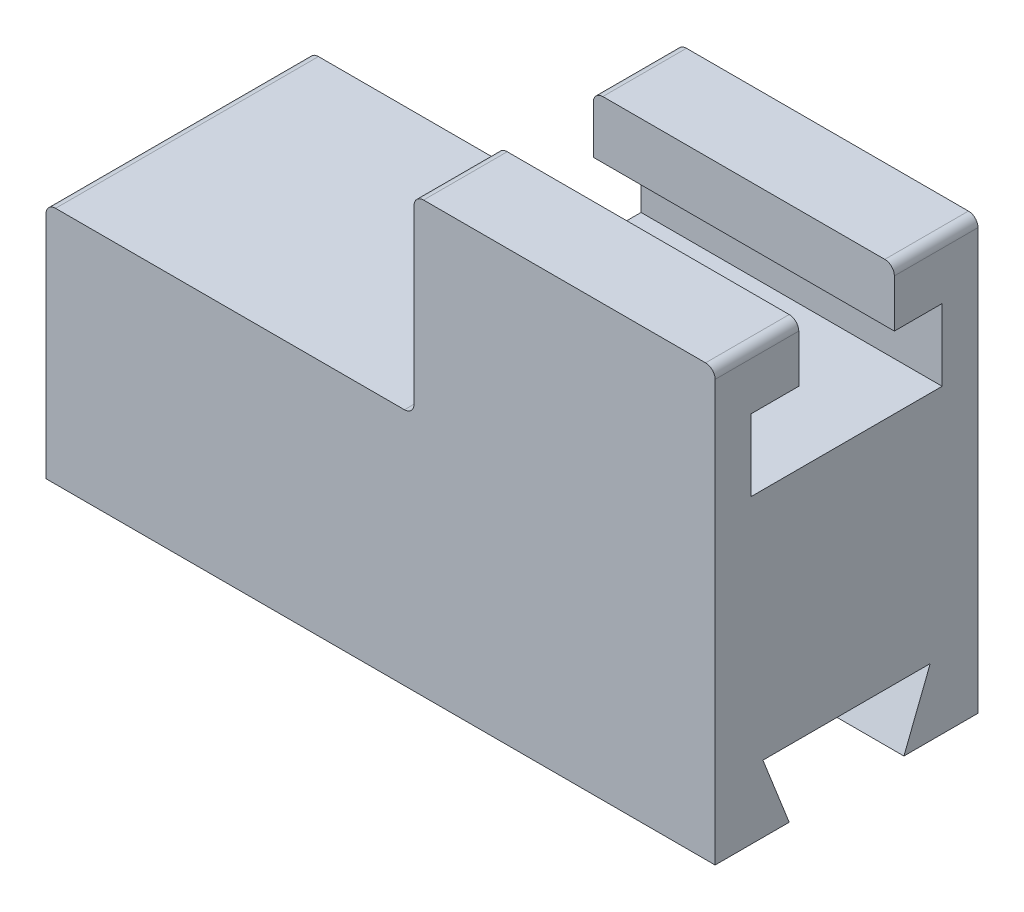
ISO-10303-21;
HEADER;
FILE_DESCRIPTION(('STEP AP214'),'2;1');
FILE_NAME('part.step','',(''),(''),'','','');
FILE_SCHEMA(('AUTOMOTIVE_DESIGN { 1 0 10303 214 1 1 1 1 }'));
ENDSEC;
DATA;
#1=APPLICATION_CONTEXT('core data for automotive mechanical design processes');
#2=APPLICATION_PROTOCOL_DEFINITION('international standard','automotive_design',2000,#1);
#3=PRODUCT_CONTEXT('',#1,'mechanical');
#4=PRODUCT('Part','Part','',(#3));
#5=PRODUCT_RELATED_PRODUCT_CATEGORY('part','',(#4));
#6=PRODUCT_DEFINITION_FORMATION('','',#4);
#7=PRODUCT_DEFINITION_CONTEXT('part definition',#1,'design');
#8=PRODUCT_DEFINITION('design','',#6,#7);
#9=PRODUCT_DEFINITION_SHAPE('','',#8);
#10=(LENGTH_UNIT() NAMED_UNIT(*) SI_UNIT(.MILLI.,.METRE.));
#11=(NAMED_UNIT(*) PLANE_ANGLE_UNIT() SI_UNIT($,.RADIAN.));
#12=(NAMED_UNIT(*) SI_UNIT($,.STERADIAN.) SOLID_ANGLE_UNIT());
#13=UNCERTAINTY_MEASURE_WITH_UNIT(LENGTH_MEASURE(1.E-05),#10,'distance_accuracy_value','');
#14=(GEOMETRIC_REPRESENTATION_CONTEXT(3) GLOBAL_UNCERTAINTY_ASSIGNED_CONTEXT((#13)) GLOBAL_UNIT_ASSIGNED_CONTEXT((#10,
#11,#12)) REPRESENTATION_CONTEXT('',''));
#15=CARTESIAN_POINT('',(0.,0.,0.));
#16=DIRECTION('',(0.,0.,1.));
#17=DIRECTION('',(1.,0.,0.));
#18=AXIS2_PLACEMENT_3D('',#15,#16,#17);
#19=CARTESIAN_POINT('',(70.,90.,27.5));
#20=DIRECTION('',(0.,-1.,0.));
#21=DIRECTION('',(1.,0.,0.));
#22=AXIS2_PLACEMENT_3D('',#19,#20,#21);
#23=PLANE('',#22);
#24=DIRECTION('',(1.,0.,0.));
#25=VECTOR('',#24,1.);
#26=CARTESIAN_POINT('',(7.00000000000001,90.,-10.));
#27=LINE('',#26,#25);
#28=CARTESIAN_POINT('',(9.00000000000001,90.,-10.));
#29=VERTEX_POINT('',#28);
#30=CARTESIAN_POINT('',(68.,90.,-10.));
#31=VERTEX_POINT('',#30);
#32=EDGE_CURVE('E254',#29,#31,#27,.T.);
#33=ORIENTED_EDGE('',*,*,#32,.T.);
#34=DIRECTION('',(0.,0.,-1.));
#35=VECTOR('',#34,1.);
#36=CARTESIAN_POINT('',(68.,90.,27.5));
#37=LINE('',#36,#35);
#38=CARTESIAN_POINT('',(68.,90.,-27.5));
#39=VERTEX_POINT('',#38);
#40=EDGE_CURVE('E367',#31,#39,#37,.T.);
#41=ORIENTED_EDGE('',*,*,#40,.T.);
#42=DIRECTION('',(-1.,0.,0.));
#43=VECTOR('',#42,1.);
#44=CARTESIAN_POINT('',(70.,90.,-27.5));
#45=LINE('',#44,#43);
#46=CARTESIAN_POINT('',(9.00000000000001,90.,-27.5));
#47=VERTEX_POINT('',#46);
#48=EDGE_CURVE('E317',#39,#47,#45,.T.);
#49=ORIENTED_EDGE('',*,*,#48,.T.);
#50=DIRECTION('',(0.,0.,-1.));
#51=VECTOR('',#50,1.);
#52=CARTESIAN_POINT('',(9.00000000000001,90.,27.5));
#53=LINE('',#52,#51);
#54=EDGE_CURVE('E354',#47,#29,#53,.F.);
#55=ORIENTED_EDGE('',*,*,#54,.T.);
#56=EDGE_LOOP('',(#33,#41,#49,#55));
#57=FACE_BOUND('',#56,.T.);
#58=ADVANCED_FACE('F33',(#57),#23,.F.);
#59=CARTESIAN_POINT('',(-70.,0.,27.5));
#60=DIRECTION('',(0.,1.,0.));
#61=DIRECTION('',(0.,0.,1.));
#62=AXIS2_PLACEMENT_3D('',#59,#60,#61);
#63=PLANE('',#62);
#64=DIRECTION('',(0.,0.,-1.));
#65=VECTOR('',#64,1.);
#66=CARTESIAN_POINT('',(70.,0.,27.5));
#67=LINE('',#66,#65);
#68=CARTESIAN_POINT('',(70.,0.,-12.));
#69=VERTEX_POINT('',#68);
#70=CARTESIAN_POINT('',(70.,0.,-27.5));
#71=VERTEX_POINT('',#70);
#72=EDGE_CURVE('E309',#69,#71,#67,.T.);
#73=ORIENTED_EDGE('',*,*,#72,.F.);
#74=DIRECTION('',(-1.,0.,0.));
#75=VECTOR('',#74,1.);
#76=CARTESIAN_POINT('',(70.,0.,-12.));
#77=LINE('',#76,#75);
#78=CARTESIAN_POINT('',(-70.,0.,-12.));
#79=VERTEX_POINT('',#78);
#80=EDGE_CURVE('E285',#69,#79,#77,.T.);
#81=ORIENTED_EDGE('',*,*,#80,.T.);
#82=DIRECTION('',(0.,0.,-1.));
#83=VECTOR('',#82,1.);
#84=CARTESIAN_POINT('',(-70.,0.,27.5));
#85=LINE('',#84,#83);
#86=CARTESIAN_POINT('',(-70.,0.,-27.5));
#87=VERTEX_POINT('',#86);
#88=EDGE_CURVE('E326',#79,#87,#85,.T.);
#89=ORIENTED_EDGE('',*,*,#88,.T.);
#90=DIRECTION('',(1.,0.,0.));
#91=VECTOR('',#90,1.);
#92=CARTESIAN_POINT('',(-70.,0.,-27.5));
#93=LINE('',#92,#91);
#94=EDGE_CURVE('E311',#87,#71,#93,.T.);
#95=ORIENTED_EDGE('',*,*,#94,.T.);
#96=EDGE_LOOP('',(#73,#81,#89,#95));
#97=FACE_BOUND('',#96,.T.);
#98=ADVANCED_FACE('F410',(#97),#63,.F.);
#99=CARTESIAN_POINT('',(-70.,50.,27.5));
#100=DIRECTION('',(1.,0.,0.));
#101=DIRECTION('',(0.,0.,-1.));
#102=AXIS2_PLACEMENT_3D('',#99,#100,#101);
#103=PLANE('',#102);
#104=DIRECTION('',(0.,-1.,0.));
#105=VECTOR('',#104,1.);
#106=CARTESIAN_POINT('',(-70.,50.,27.5));
#107=LINE('',#106,#105);
#108=CARTESIAN_POINT('',(-70.,48.,27.5));
#109=VERTEX_POINT('',#108);
#110=CARTESIAN_POINT('',(-70.,0.,27.5));
#111=VERTEX_POINT('',#110);
#112=EDGE_CURVE('E294',#109,#111,#107,.T.);
#113=ORIENTED_EDGE('',*,*,#112,.F.);
#114=DIRECTION('',(0.,0.,-1.));
#115=VECTOR('',#114,1.);
#116=CARTESIAN_POINT('',(-70.,48.,27.5));
#117=LINE('',#116,#115);
#118=CARTESIAN_POINT('',(-70.,48.,-27.5));
#119=VERTEX_POINT('',#118);
#120=EDGE_CURVE('E330',#109,#119,#117,.T.);
#121=ORIENTED_EDGE('',*,*,#120,.T.);
#122=DIRECTION('',(0.,-1.,0.));
#123=VECTOR('',#122,1.);
#124=CARTESIAN_POINT('',(-70.,50.,-27.5));
#125=LINE('',#124,#123);
#126=EDGE_CURVE('E288',#119,#87,#125,.T.);
#127=ORIENTED_EDGE('',*,*,#126,.T.);
#128=ORIENTED_EDGE('',*,*,#88,.F.);
#129=DIRECTION('',(0.,-0.930751493440347,0.365652372422994));
#130=VECTOR('',#129,1.);
#131=CARTESIAN_POINT('',(-70.,0.,-12.));
#132=LINE('',#131,#130);
#133=CARTESIAN_POINT('',(-70.,14.,-17.5));
#134=VERTEX_POINT('',#133);
#135=EDGE_CURVE('E272',#134,#79,#132,.T.);
#136=ORIENTED_EDGE('',*,*,#135,.F.);
#137=DIRECTION('',(0.,0.,-1.));
#138=VECTOR('',#137,1.);
#139=CARTESIAN_POINT('',(-70.,14.,-17.5));
#140=LINE('',#139,#138);
#141=CARTESIAN_POINT('',(-70.,14.,17.5));
#142=VERTEX_POINT('',#141);
#143=EDGE_CURVE('E281',#142,#134,#140,.T.);
#144=ORIENTED_EDGE('',*,*,#143,.F.);
#145=DIRECTION('',(0.,0.930751493440347,0.365652372422994));
#146=VECTOR('',#145,1.);
#147=CARTESIAN_POINT('',(-70.,14.,17.5));
#148=LINE('',#147,#146);
#149=CARTESIAN_POINT('',(-70.,0.,12.));
#150=VERTEX_POINT('',#149);
#151=EDGE_CURVE('E257',#150,#142,#148,.T.);
#152=ORIENTED_EDGE('',*,*,#151,.F.);
#153=EDGE_CURVE('E327',#111,#150,#85,.T.);
#154=ORIENTED_EDGE('',*,*,#153,.F.);
#155=EDGE_LOOP('',(#113,#121,#127,#128,#136,#144,#152,#154));
#156=FACE_BOUND('',#155,.T.);
#157=ADVANCED_FACE('F416',(#156),#103,.F.);
#158=ORIENTED_EDGE('',*,*,#153,.T.);
#159=DIRECTION('',(-1.,0.,0.));
#160=VECTOR('',#159,1.);
#161=CARTESIAN_POINT('',(70.,0.,12.));
#162=LINE('',#161,#160);
#163=CARTESIAN_POINT('',(70.,0.,12.));
#164=VERTEX_POINT('',#163);
#165=EDGE_CURVE('E278',#164,#150,#162,.T.);
#166=ORIENTED_EDGE('',*,*,#165,.F.);
#167=CARTESIAN_POINT('',(70.,0.,27.5));
#168=VERTEX_POINT('',#167);
#169=EDGE_CURVE('E323',#168,#164,#67,.T.);
#170=ORIENTED_EDGE('',*,*,#169,.F.);
#171=DIRECTION('',(1.,0.,0.));
#172=VECTOR('',#171,1.);
#173=CARTESIAN_POINT('',(-70.,0.,27.5));
#174=LINE('',#173,#172);
#175=EDGE_CURVE('E296',#111,#168,#174,.T.);
#176=ORIENTED_EDGE('',*,*,#175,.F.);
#177=EDGE_LOOP('',(#158,#166,#170,#176));
#178=FACE_BOUND('',#177,.T.);
#179=ADVANCED_FACE('F419',(#178),#63,.F.);
#180=CARTESIAN_POINT('',(70.,0.,27.5));
#181=DIRECTION('',(-1.,0.,0.));
#182=DIRECTION('',(0.,0.,1.));
#183=AXIS2_PLACEMENT_3D('',#180,#181,#182);
#184=PLANE('',#183);
#185=DIRECTION('',(0.,1.,0.));
#186=VECTOR('',#185,1.);
#187=CARTESIAN_POINT('',(70.,0.,-27.5));
#188=LINE('',#187,#186);
#189=CARTESIAN_POINT('',(70.,88.,-27.5));
#190=VERTEX_POINT('',#189);
#191=EDGE_CURVE('E314',#71,#190,#188,.T.);
#192=ORIENTED_EDGE('',*,*,#191,.T.);
#193=DIRECTION('',(0.,0.,-1.));
#194=VECTOR('',#193,1.);
#195=CARTESIAN_POINT('',(70.,88.,27.5));
#196=LINE('',#195,#194);
#197=CARTESIAN_POINT('',(70.,88.,-10.));
#198=VERTEX_POINT('',#197);
#199=EDGE_CURVE('E374',#190,#198,#196,.F.);
#200=ORIENTED_EDGE('',*,*,#199,.T.);
#201=DIRECTION('',(0.,1.,0.));
#202=VECTOR('',#201,1.);
#203=CARTESIAN_POINT('',(70.,78.,-10.));
#204=LINE('',#203,#202);
#205=CARTESIAN_POINT('',(70.,78.,-10.));
#206=VERTEX_POINT('',#205);
#207=EDGE_CURVE('E222',#206,#198,#204,.T.);
#208=ORIENTED_EDGE('',*,*,#207,.F.);
#209=DIRECTION('',(0.,0.,1.));
#210=VECTOR('',#209,1.);
#211=CARTESIAN_POINT('',(70.,78.,-20.));
#212=LINE('',#211,#210);
#213=CARTESIAN_POINT('',(70.,78.,-20.));
#214=VERTEX_POINT('',#213);
#215=EDGE_CURVE('E249',#214,#206,#212,.T.);
#216=ORIENTED_EDGE('',*,*,#215,.F.);
#217=DIRECTION('',(0.,1.,0.));
#218=VECTOR('',#217,1.);
#219=CARTESIAN_POINT('',(70.,63.,-20.));
#220=LINE('',#219,#218);
#221=CARTESIAN_POINT('',(70.,63.,-20.));
#222=VERTEX_POINT('',#221);
#223=EDGE_CURVE('E246',#222,#214,#220,.T.);
#224=ORIENTED_EDGE('',*,*,#223,.F.);
#225=DIRECTION('',(0.,0.,-1.));
#226=VECTOR('',#225,1.);
#227=CARTESIAN_POINT('',(70.,63.,20.));
#228=LINE('',#227,#226);
#229=CARTESIAN_POINT('',(70.,63.,20.));
#230=VERTEX_POINT('',#229);
#231=EDGE_CURVE('E243',#230,#222,#228,.T.);
#232=ORIENTED_EDGE('',*,*,#231,.F.);
#233=DIRECTION('',(0.,-1.,0.));
#234=VECTOR('',#233,1.);
#235=CARTESIAN_POINT('',(70.,78.,20.));
#236=LINE('',#235,#234);
#237=CARTESIAN_POINT('',(70.,78.,20.));
#238=VERTEX_POINT('',#237);
#239=EDGE_CURVE('E241',#238,#230,#236,.T.);
#240=ORIENTED_EDGE('',*,*,#239,.F.);
#241=DIRECTION('',(0.,0.,1.));
#242=VECTOR('',#241,1.);
#243=CARTESIAN_POINT('',(70.,78.,10.));
#244=LINE('',#243,#242);
#245=CARTESIAN_POINT('',(70.,78.,10.));
#246=VERTEX_POINT('',#245);
#247=EDGE_CURVE('E201',#246,#238,#244,.T.);
#248=ORIENTED_EDGE('',*,*,#247,.F.);
#249=DIRECTION('',(0.,-1.,0.));
#250=VECTOR('',#249,1.);
#251=CARTESIAN_POINT('',(70.,90.,10.));
#252=LINE('',#251,#250);
#253=CARTESIAN_POINT('',(70.,88.,10.));
#254=VERTEX_POINT('',#253);
#255=EDGE_CURVE('E237',#254,#246,#252,.T.);
#256=ORIENTED_EDGE('',*,*,#255,.F.);
#257=DIRECTION('',(0.,0.,-1.));
#258=VECTOR('',#257,1.);
#259=CARTESIAN_POINT('',(70.,88.,27.5));
#260=LINE('',#259,#258);
#261=CARTESIAN_POINT('',(70.,88.,27.5));
#262=VERTEX_POINT('',#261);
#263=EDGE_CURVE('E372',#254,#262,#260,.F.);
#264=ORIENTED_EDGE('',*,*,#263,.T.);
#265=DIRECTION('',(0.,1.,0.));
#266=VECTOR('',#265,1.);
#267=CARTESIAN_POINT('',(70.,0.,27.5));
#268=LINE('',#267,#266);
#269=EDGE_CURVE('E299',#168,#262,#268,.T.);
#270=ORIENTED_EDGE('',*,*,#269,.F.);
#271=ORIENTED_EDGE('',*,*,#169,.T.);
#272=DIRECTION('',(0.,0.930751493440347,0.365652372422994));
#273=VECTOR('',#272,1.);
#274=CARTESIAN_POINT('',(70.,14.,17.5));
#275=LINE('',#274,#273);
#276=CARTESIAN_POINT('',(70.,14.,17.5));
#277=VERTEX_POINT('',#276);
#278=EDGE_CURVE('E268',#164,#277,#275,.T.);
#279=ORIENTED_EDGE('',*,*,#278,.T.);
#280=DIRECTION('',(0.,0.,-1.));
#281=VECTOR('',#280,1.);
#282=CARTESIAN_POINT('',(70.,14.,-17.5));
#283=LINE('',#282,#281);
#284=CARTESIAN_POINT('',(70.,14.,-17.5));
#285=VERTEX_POINT('',#284);
#286=EDGE_CURVE('E271',#277,#285,#283,.T.);
#287=ORIENTED_EDGE('',*,*,#286,.T.);
#288=DIRECTION('',(0.,-0.930751493440347,0.365652372422994));
#289=VECTOR('',#288,1.);
#290=CARTESIAN_POINT('',(70.,0.,-12.));
#291=LINE('',#290,#289);
#292=EDGE_CURVE('E275',#285,#69,#291,.T.);
#293=ORIENTED_EDGE('',*,*,#292,.T.);
#294=ORIENTED_EDGE('',*,*,#72,.T.);
#295=EDGE_LOOP('',(#192,#200,#208,#216,#224,#232,#240,#248,#256,#264,#270,#271,#279,#287,#293,#294));
#296=FACE_BOUND('',#295,.T.);
#297=ADVANCED_FACE('F384',(#296),#184,.F.);
#298=DIRECTION('',(-1.,0.,0.));
#299=VECTOR('',#298,1.);
#300=CARTESIAN_POINT('',(70.,90.,27.5));
#301=LINE('',#300,#299);
#302=CARTESIAN_POINT('',(68.,90.,27.5));
#303=VERTEX_POINT('',#302);
#304=CARTESIAN_POINT('',(9.00000000000001,90.,27.5));
#305=VERTEX_POINT('',#304);
#306=EDGE_CURVE('E301',#303,#305,#301,.T.);
#307=ORIENTED_EDGE('',*,*,#306,.F.);
#308=DIRECTION('',(0.,0.,-1.));
#309=VECTOR('',#308,1.);
#310=CARTESIAN_POINT('',(68.,90.,27.5));
#311=LINE('',#310,#309);
#312=CARTESIAN_POINT('',(68.,90.,10.));
#313=VERTEX_POINT('',#312);
#314=EDGE_CURVE('E378',#303,#313,#311,.T.);
#315=ORIENTED_EDGE('',*,*,#314,.T.);
#316=DIRECTION('',(1.,0.,0.));
#317=VECTOR('',#316,1.);
#318=CARTESIAN_POINT('',(7.00000000000001,90.,10.));
#319=LINE('',#318,#317);
#320=CARTESIAN_POINT('',(9.00000000000001,90.,10.));
#321=VERTEX_POINT('',#320);
#322=EDGE_CURVE('E236',#321,#313,#319,.T.);
#323=ORIENTED_EDGE('',*,*,#322,.F.);
#324=DIRECTION('',(0.,0.,-1.));
#325=VECTOR('',#324,1.);
#326=CARTESIAN_POINT('',(9.00000000000001,90.,27.5));
#327=LINE('',#326,#325);
#328=EDGE_CURVE('E360',#321,#305,#327,.F.);
#329=ORIENTED_EDGE('',*,*,#328,.T.);
#330=EDGE_LOOP('',(#307,#315,#323,#329));
#331=FACE_BOUND('',#330,.T.);
#332=ADVANCED_FACE('F387',(#331),#23,.F.);
#333=CARTESIAN_POINT('',(7.00000000000001,90.,27.5));
#334=DIRECTION('',(1.,0.,0.));
#335=DIRECTION('',(0.,0.,-1.));
#336=AXIS2_PLACEMENT_3D('',#333,#334,#335);
#337=PLANE('',#336);
#338=DIRECTION('',(0.,-1.,0.));
#339=VECTOR('',#338,1.);
#340=CARTESIAN_POINT('',(7.00000000000001,90.,-27.5));
#341=LINE('',#340,#339);
#342=CARTESIAN_POINT('',(7.00000000000001,88.,-27.5));
#343=VERTEX_POINT('',#342);
#344=CARTESIAN_POINT('',(7.00000000000001,52.,-27.5));
#345=VERTEX_POINT('',#344);
#346=EDGE_CURVE('E319',#343,#345,#341,.T.);
#347=ORIENTED_EDGE('',*,*,#346,.T.);
#348=DIRECTION('',(0.,0.,-1.));
#349=VECTOR('',#348,1.);
#350=CARTESIAN_POINT('',(7.00000000000001,52.,27.5));
#351=LINE('',#350,#349);
#352=CARTESIAN_POINT('',(7.00000000000001,52.,27.5));
#353=VERTEX_POINT('',#352);
#354=EDGE_CURVE('E352',#345,#353,#351,.F.);
#355=ORIENTED_EDGE('',*,*,#354,.T.);
#356=DIRECTION('',(0.,-1.,0.));
#357=VECTOR('',#356,1.);
#358=CARTESIAN_POINT('',(7.00000000000001,90.,27.5));
#359=LINE('',#358,#357);
#360=CARTESIAN_POINT('',(7.00000000000001,88.,27.5));
#361=VERTEX_POINT('',#360);
#362=EDGE_CURVE('E303',#361,#353,#359,.T.);
#363=ORIENTED_EDGE('',*,*,#362,.F.);
#364=DIRECTION('',(0.,0.,-1.));
#365=VECTOR('',#364,1.);
#366=CARTESIAN_POINT('',(7.00000000000001,88.,27.5));
#367=LINE('',#366,#365);
#368=CARTESIAN_POINT('',(7.00000000000001,88.,10.));
#369=VERTEX_POINT('',#368);
#370=EDGE_CURVE('E347',#361,#369,#367,.T.);
#371=ORIENTED_EDGE('',*,*,#370,.T.);
#372=DIRECTION('',(0.,-1.,0.));
#373=VECTOR('',#372,1.);
#374=CARTESIAN_POINT('',(7.00000000000001,90.,10.));
#375=LINE('',#374,#373);
#376=CARTESIAN_POINT('',(7.00000000000001,78.,10.));
#377=VERTEX_POINT('',#376);
#378=EDGE_CURVE('E220',#369,#377,#375,.T.);
#379=ORIENTED_EDGE('',*,*,#378,.T.);
#380=DIRECTION('',(0.,0.,1.));
#381=VECTOR('',#380,1.);
#382=CARTESIAN_POINT('',(7.00000000000001,78.,10.));
#383=LINE('',#382,#381);
#384=CARTESIAN_POINT('',(7.00000000000001,78.,20.));
#385=VERTEX_POINT('',#384);
#386=EDGE_CURVE('E198',#377,#385,#383,.T.);
#387=ORIENTED_EDGE('',*,*,#386,.T.);
#388=DIRECTION('',(0.,-1.,0.));
#389=VECTOR('',#388,1.);
#390=CARTESIAN_POINT('',(7.00000000000001,78.,20.));
#391=LINE('',#390,#389);
#392=CARTESIAN_POINT('',(7.00000000000001,63.,20.));
#393=VERTEX_POINT('',#392);
#394=EDGE_CURVE('E209',#385,#393,#391,.T.);
#395=ORIENTED_EDGE('',*,*,#394,.T.);
#396=DIRECTION('',(0.,0.,-1.));
#397=VECTOR('',#396,1.);
#398=CARTESIAN_POINT('',(7.00000000000001,63.,20.));
#399=LINE('',#398,#397);
#400=CARTESIAN_POINT('',(7.00000000000001,63.,-20.));
#401=VERTEX_POINT('',#400);
#402=EDGE_CURVE('E214',#393,#401,#399,.T.);
#403=ORIENTED_EDGE('',*,*,#402,.T.);
#404=DIRECTION('',(0.,1.,0.));
#405=VECTOR('',#404,1.);
#406=CARTESIAN_POINT('',(7.00000000000001,63.,-20.));
#407=LINE('',#406,#405);
#408=CARTESIAN_POINT('',(7.00000000000001,78.,-20.));
#409=VERTEX_POINT('',#408);
#410=EDGE_CURVE('E227',#401,#409,#407,.T.);
#411=ORIENTED_EDGE('',*,*,#410,.T.);
#412=DIRECTION('',(0.,0.,1.));
#413=VECTOR('',#412,1.);
#414=CARTESIAN_POINT('',(7.00000000000001,78.,-20.));
#415=LINE('',#414,#413);
#416=CARTESIAN_POINT('',(7.00000000000001,78.,-10.));
#417=VERTEX_POINT('',#416);
#418=EDGE_CURVE('E230',#409,#417,#415,.T.);
#419=ORIENTED_EDGE('',*,*,#418,.T.);
#420=DIRECTION('',(0.,1.,0.));
#421=VECTOR('',#420,1.);
#422=CARTESIAN_POINT('',(7.00000000000001,78.,-10.));
#423=LINE('',#422,#421);
#424=CARTESIAN_POINT('',(7.00000000000001,88.,-10.));
#425=VERTEX_POINT('',#424);
#426=EDGE_CURVE('E233',#417,#425,#423,.T.);
#427=ORIENTED_EDGE('',*,*,#426,.T.);
#428=DIRECTION('',(0.,0.,-1.));
#429=VECTOR('',#428,1.);
#430=CARTESIAN_POINT('',(7.00000000000001,88.,27.5));
#431=LINE('',#430,#429);
#432=EDGE_CURVE('E349',#425,#343,#431,.T.);
#433=ORIENTED_EDGE('',*,*,#432,.T.);
#434=EDGE_LOOP('',(#347,#355,#363,#371,#379,#387,#395,#403,#411,#419,#427,#433));
#435=FACE_BOUND('',#434,.T.);
#436=ADVANCED_FACE('F217',(#435),#337,.F.);
#437=CARTESIAN_POINT('',(7.00000000000001,50.,27.5));
#438=DIRECTION('',(0.,-1.,0.));
#439=DIRECTION('',(1.,0.,0.));
#440=AXIS2_PLACEMENT_3D('',#437,#438,#439);
#441=PLANE('',#440);
#442=DIRECTION('',(-1.,0.,0.));
#443=VECTOR('',#442,1.);
#444=CARTESIAN_POINT('',(7.00000000000001,50.,-27.5));
#445=LINE('',#444,#443);
#446=CARTESIAN_POINT('',(5.00000000000001,50.,-27.5));
#447=VERTEX_POINT('',#446);
#448=CARTESIAN_POINT('',(-68.,50.,-27.5));
#449=VERTEX_POINT('',#448);
#450=EDGE_CURVE('E297',#447,#449,#445,.T.);
#451=ORIENTED_EDGE('',*,*,#450,.T.);
#452=DIRECTION('',(0.,0.,-1.));
#453=VECTOR('',#452,1.);
#454=CARTESIAN_POINT('',(-68.,50.,27.5));
#455=LINE('',#454,#453);
#456=CARTESIAN_POINT('',(-68.,50.,27.5));
#457=VERTEX_POINT('',#456);
#458=EDGE_CURVE('E341',#449,#457,#455,.F.);
#459=ORIENTED_EDGE('',*,*,#458,.T.);
#460=DIRECTION('',(-1.,0.,0.));
#461=VECTOR('',#460,1.);
#462=CARTESIAN_POINT('',(7.00000000000001,50.,27.5));
#463=LINE('',#462,#461);
#464=CARTESIAN_POINT('',(5.00000000000001,50.,27.5));
#465=VERTEX_POINT('',#464);
#466=EDGE_CURVE('E306',#465,#457,#463,.T.);
#467=ORIENTED_EDGE('',*,*,#466,.F.);
#468=DIRECTION('',(0.,0.,-1.));
#469=VECTOR('',#468,1.);
#470=CARTESIAN_POINT('',(5.00000000000001,50.,-27.5));
#471=LINE('',#470,#469);
#472=EDGE_CURVE('E338',#465,#447,#471,.T.);
#473=ORIENTED_EDGE('',*,*,#472,.T.);
#474=EDGE_LOOP('',(#451,#459,#467,#473));
#475=FACE_BOUND('',#474,.T.);
#476=ADVANCED_FACE('F427',(#475),#441,.F.);
#477=CARTESIAN_POINT('',(0.,0.,27.5));
#478=DIRECTION('',(0.,0.,1.));
#479=DIRECTION('',(1.,0.,0.));
#480=AXIS2_PLACEMENT_3D('',#477,#478,#479);
#481=PLANE('',#480);
#482=ORIENTED_EDGE('',*,*,#269,.T.);
#483=CARTESIAN_POINT('',(68.,88.,27.5));
#484=DIRECTION('',(0.,0.,1.));
#485=DIRECTION('',(1.,0.,0.));
#486=AXIS2_PLACEMENT_3D('',#483,#484,#485);
#487=CIRCLE('',#486,2.);
#488=EDGE_CURVE('E11',#262,#303,#487,.T.);
#489=ORIENTED_EDGE('',*,*,#488,.T.);
#490=ORIENTED_EDGE('',*,*,#306,.T.);
#491=CARTESIAN_POINT('',(9.00000000000001,88.,27.5));
#492=DIRECTION('',(0.,0.,1.));
#493=DIRECTION('',(1.,0.,0.));
#494=AXIS2_PLACEMENT_3D('',#491,#492,#493);
#495=CIRCLE('',#494,2.);
#496=EDGE_CURVE('E343',#305,#361,#495,.T.);
#497=ORIENTED_EDGE('',*,*,#496,.T.);
#498=ORIENTED_EDGE('',*,*,#362,.T.);
#499=CARTESIAN_POINT('',(5.00000000000001,52.,27.5));
#500=DIRECTION('',(0.,0.,1.));
#501=DIRECTION('',(1.,0.,0.));
#502=AXIS2_PLACEMENT_3D('',#499,#500,#501);
#503=CIRCLE('',#502,2.);
#504=EDGE_CURVE('E365',#353,#465,#503,.F.);
#505=ORIENTED_EDGE('',*,*,#504,.T.);
#506=ORIENTED_EDGE('',*,*,#466,.T.);
#507=CARTESIAN_POINT('',(-68.,48.,27.5));
#508=DIRECTION('',(0.,0.,1.));
#509=DIRECTION('',(1.,0.,0.));
#510=AXIS2_PLACEMENT_3D('',#507,#508,#509);
#511=CIRCLE('',#510,2.);
#512=EDGE_CURVE('E345',#457,#109,#511,.T.);
#513=ORIENTED_EDGE('',*,*,#512,.T.);
#514=ORIENTED_EDGE('',*,*,#112,.T.);
#515=ORIENTED_EDGE('',*,*,#175,.T.);
#516=EDGE_LOOP('',(#482,#489,#490,#497,#498,#505,#506,#513,#514,#515));
#517=FACE_BOUND('',#516,.T.);
#518=ADVANCED_FACE('F390',(#517),#481,.T.);
#519=CARTESIAN_POINT('',(0.,0.,-27.5));
#520=DIRECTION('',(0.,0.,1.));
#521=DIRECTION('',(1.,0.,0.));
#522=AXIS2_PLACEMENT_3D('',#519,#520,#521);
#523=PLANE('',#522);
#524=ORIENTED_EDGE('',*,*,#48,.F.);
#525=CARTESIAN_POINT('',(68.,88.,-27.5));
#526=DIRECTION('',(0.,0.,1.));
#527=DIRECTION('',(1.,0.,0.));
#528=AXIS2_PLACEMENT_3D('',#525,#526,#527);
#529=CIRCLE('',#528,2.);
#530=EDGE_CURVE('E370',#39,#190,#529,.F.);
#531=ORIENTED_EDGE('',*,*,#530,.T.);
#532=ORIENTED_EDGE('',*,*,#191,.F.);
#533=ORIENTED_EDGE('',*,*,#94,.F.);
#534=ORIENTED_EDGE('',*,*,#126,.F.);
#535=CARTESIAN_POINT('',(-68.,48.,-27.5));
#536=DIRECTION('',(0.,0.,1.));
#537=DIRECTION('',(1.,0.,0.));
#538=AXIS2_PLACEMENT_3D('',#535,#536,#537);
#539=CIRCLE('',#538,2.);
#540=EDGE_CURVE('E336',#119,#449,#539,.F.);
#541=ORIENTED_EDGE('',*,*,#540,.T.);
#542=ORIENTED_EDGE('',*,*,#450,.F.);
#543=CARTESIAN_POINT('',(5.00000000000001,52.,-27.5));
#544=DIRECTION('',(0.,0.,1.));
#545=DIRECTION('',(1.,0.,0.));
#546=AXIS2_PLACEMENT_3D('',#543,#544,#545);
#547=CIRCLE('',#546,2.);
#548=EDGE_CURVE('E363',#447,#345,#547,.T.);
#549=ORIENTED_EDGE('',*,*,#548,.T.);
#550=ORIENTED_EDGE('',*,*,#346,.F.);
#551=CARTESIAN_POINT('',(9.00000000000001,88.,-27.5));
#552=DIRECTION('',(0.,0.,1.));
#553=DIRECTION('',(1.,0.,0.));
#554=AXIS2_PLACEMENT_3D('',#551,#552,#553);
#555=CIRCLE('',#554,2.);
#556=EDGE_CURVE('E333',#343,#47,#555,.F.);
#557=ORIENTED_EDGE('',*,*,#556,.T.);
#558=EDGE_LOOP('',(#524,#531,#532,#533,#534,#541,#542,#549,#550,#557));
#559=FACE_BOUND('',#558,.T.);
#560=ADVANCED_FACE('F477',(#559),#523,.F.);
#561=CARTESIAN_POINT('',(70.,0.,-12.));
#562=DIRECTION('',(0.,-0.365652372422994,-0.930751493440347));
#563=DIRECTION('',(0.,0.930751493440347,-0.365652372422994));
#564=AXIS2_PLACEMENT_3D('',#561,#562,#563);
#565=PLANE('',#564);
#566=ORIENTED_EDGE('',*,*,#135,.T.);
#567=ORIENTED_EDGE('',*,*,#80,.F.);
#568=ORIENTED_EDGE('',*,*,#292,.F.);
#569=DIRECTION('',(-1.,0.,0.));
#570=VECTOR('',#569,1.);
#571=CARTESIAN_POINT('',(70.,14.,-17.5));
#572=LINE('',#571,#570);
#573=EDGE_CURVE('E289',#285,#134,#572,.T.);
#574=ORIENTED_EDGE('',*,*,#573,.T.);
#575=EDGE_LOOP('',(#566,#567,#568,#574));
#576=FACE_BOUND('',#575,.T.);
#577=ADVANCED_FACE('F469',(#576),#565,.F.);
#578=CARTESIAN_POINT('',(70.,14.,-17.5));
#579=DIRECTION('',(0.,1.,0.));
#580=DIRECTION('',(0.,0.,1.));
#581=AXIS2_PLACEMENT_3D('',#578,#579,#580);
#582=PLANE('',#581);
#583=CARTESIAN_POINT('',(-29.7803779166077,14.,0.));
#584=DIRECTION('',(0.,1.,0.));
#585=DIRECTION('',(0.,0.,1.));
#586=AXIS2_PLACEMENT_3D('',#583,#584,#585);
#587=CIRCLE('',#586,8.);
#588=CARTESIAN_POINT('',(-29.7803779166077,14.,8.));
#589=VERTEX_POINT('',#588);
#590=EDGE_CURVE('E239',#589,#589,#587,.F.);
#591=ORIENTED_EDGE('',*,*,#590,.F.);
#592=EDGE_LOOP('',(#591));
#593=FACE_BOUND('',#592,.T.);
#594=ORIENTED_EDGE('',*,*,#143,.T.);
#595=ORIENTED_EDGE('',*,*,#573,.F.);
#596=ORIENTED_EDGE('',*,*,#286,.F.);
#597=DIRECTION('',(-1.,0.,0.));
#598=VECTOR('',#597,1.);
#599=CARTESIAN_POINT('',(70.,14.,17.5));
#600=LINE('',#599,#598);
#601=EDGE_CURVE('E291',#277,#142,#600,.T.);
#602=ORIENTED_EDGE('',*,*,#601,.T.);
#603=EDGE_LOOP('',(#594,#595,#596,#602));
#604=FACE_BOUND('',#603,.T.);
#605=ADVANCED_FACE('F465',(#593,#604),#582,.F.);
#606=CARTESIAN_POINT('',(70.,14.,17.5));
#607=DIRECTION('',(0.,-0.365652372422993,0.930751493440347));
#608=DIRECTION('',(0.,-0.930751493440347,-0.365652372422994));
#609=AXIS2_PLACEMENT_3D('',#606,#607,#608);
#610=PLANE('',#609);
#611=ORIENTED_EDGE('',*,*,#151,.T.);
#612=ORIENTED_EDGE('',*,*,#601,.F.);
#613=ORIENTED_EDGE('',*,*,#278,.F.);
#614=ORIENTED_EDGE('',*,*,#165,.T.);
#615=EDGE_LOOP('',(#611,#612,#613,#614));
#616=FACE_BOUND('',#615,.T.);
#617=ADVANCED_FACE('F463',(#616),#610,.F.);
#618=CARTESIAN_POINT('',(7.00000000000001,78.,-10.));
#619=DIRECTION('',(0.,0.,-1.));
#620=DIRECTION('',(0.,1.,0.));
#621=AXIS2_PLACEMENT_3D('',#618,#619,#620);
#622=PLANE('',#621);
#623=ORIENTED_EDGE('',*,*,#207,.T.);
#624=CARTESIAN_POINT('',(68.,88.,-10.));
#625=DIRECTION('',(0.,0.,-1.));
#626=DIRECTION('',(0.,1.,0.));
#627=AXIS2_PLACEMENT_3D('',#624,#625,#626);
#628=CIRCLE('',#627,2.);
#629=EDGE_CURVE('E376',#198,#31,#628,.F.);
#630=ORIENTED_EDGE('',*,*,#629,.T.);
#631=ORIENTED_EDGE('',*,*,#32,.F.);
#632=CARTESIAN_POINT('',(9.00000000000001,88.,-10.));
#633=DIRECTION('',(0.,0.,-1.));
#634=DIRECTION('',(0.,1.,0.));
#635=AXIS2_PLACEMENT_3D('',#632,#633,#634);
#636=CIRCLE('',#635,2.);
#637=EDGE_CURVE('E356',#29,#425,#636,.F.);
#638=ORIENTED_EDGE('',*,*,#637,.T.);
#639=ORIENTED_EDGE('',*,*,#426,.F.);
#640=DIRECTION('',(1.,0.,0.));
#641=VECTOR('',#640,1.);
#642=CARTESIAN_POINT('',(7.00000000000001,78.,-10.));
#643=LINE('',#642,#641);
#644=EDGE_CURVE('E258',#417,#206,#643,.T.);
#645=ORIENTED_EDGE('',*,*,#644,.T.);
#646=EDGE_LOOP('',(#623,#630,#631,#638,#639,#645));
#647=FACE_BOUND('',#646,.T.);
#648=ADVANCED_FACE('F484',(#647),#622,.F.);
#649=CARTESIAN_POINT('',(7.00000000000001,78.,-20.));
#650=DIRECTION('',(0.,1.,0.));
#651=DIRECTION('',(0.,0.,1.));
#652=AXIS2_PLACEMENT_3D('',#649,#650,#651);
#653=PLANE('',#652);
#654=ORIENTED_EDGE('',*,*,#215,.T.);
#655=ORIENTED_EDGE('',*,*,#644,.F.);
#656=ORIENTED_EDGE('',*,*,#418,.F.);
#657=DIRECTION('',(1.,0.,0.));
#658=VECTOR('',#657,1.);
#659=CARTESIAN_POINT('',(7.00000000000001,78.,-20.));
#660=LINE('',#659,#658);
#661=EDGE_CURVE('E260',#409,#214,#660,.T.);
#662=ORIENTED_EDGE('',*,*,#661,.T.);
#663=EDGE_LOOP('',(#654,#655,#656,#662));
#664=FACE_BOUND('',#663,.T.);
#665=ADVANCED_FACE('F493',(#664),#653,.F.);
#666=CARTESIAN_POINT('',(7.00000000000001,63.,-20.));
#667=DIRECTION('',(0.,0.,-1.));
#668=DIRECTION('',(-1.,0.,0.));
#669=AXIS2_PLACEMENT_3D('',#666,#667,#668);
#670=PLANE('',#669);
#671=ORIENTED_EDGE('',*,*,#223,.T.);
#672=ORIENTED_EDGE('',*,*,#661,.F.);
#673=ORIENTED_EDGE('',*,*,#410,.F.);
#674=DIRECTION('',(1.,0.,0.));
#675=VECTOR('',#674,1.);
#676=CARTESIAN_POINT('',(7.00000000000001,63.,-20.));
#677=LINE('',#676,#675);
#678=EDGE_CURVE('E262',#401,#222,#677,.T.);
#679=ORIENTED_EDGE('',*,*,#678,.T.);
#680=EDGE_LOOP('',(#671,#672,#673,#679));
#681=FACE_BOUND('',#680,.T.);
#682=ADVANCED_FACE('F498',(#681),#670,.F.);
#683=CARTESIAN_POINT('',(7.00000000000001,63.,20.));
#684=DIRECTION('',(0.,-1.,0.));
#685=DIRECTION('',(0.,0.,-1.));
#686=AXIS2_PLACEMENT_3D('',#683,#684,#685);
#687=PLANE('',#686);
#688=CARTESIAN_POINT('',(38.7196220833923,63.,0.));
#689=DIRECTION('',(0.,-1.,0.));
#690=DIRECTION('',(0.,0.,-1.));
#691=AXIS2_PLACEMENT_3D('',#688,#689,#690);
#692=CIRCLE('',#691,8.);
#693=CARTESIAN_POINT('',(38.7196220833923,63.,-8.));
#694=VERTEX_POINT('',#693);
#695=EDGE_CURVE('E724',#694,#694,#692,.F.);
#696=ORIENTED_EDGE('',*,*,#695,.F.);
#697=EDGE_LOOP('',(#696));
#698=FACE_BOUND('',#697,.T.);
#699=ORIENTED_EDGE('',*,*,#231,.T.);
#700=ORIENTED_EDGE('',*,*,#678,.F.);
#701=ORIENTED_EDGE('',*,*,#402,.F.);
#702=DIRECTION('',(1.,0.,0.));
#703=VECTOR('',#702,1.);
#704=CARTESIAN_POINT('',(7.00000000000001,63.,20.));
#705=LINE('',#704,#703);
#706=EDGE_CURVE('E205',#393,#230,#705,.T.);
#707=ORIENTED_EDGE('',*,*,#706,.T.);
#708=EDGE_LOOP('',(#699,#700,#701,#707));
#709=FACE_BOUND('',#708,.T.);
#710=ADVANCED_FACE('F500',(#698,#709),#687,.F.);
#711=CARTESIAN_POINT('',(7.00000000000001,78.,20.));
#712=DIRECTION('',(0.,0.,1.));
#713=DIRECTION('',(1.,0.,0.));
#714=AXIS2_PLACEMENT_3D('',#711,#712,#713);
#715=PLANE('',#714);
#716=ORIENTED_EDGE('',*,*,#239,.T.);
#717=ORIENTED_EDGE('',*,*,#706,.F.);
#718=ORIENTED_EDGE('',*,*,#394,.F.);
#719=DIRECTION('',(1.,0.,0.));
#720=VECTOR('',#719,1.);
#721=CARTESIAN_POINT('',(7.00000000000001,78.,20.));
#722=LINE('',#721,#720);
#723=EDGE_CURVE('E193',#385,#238,#722,.T.);
#724=ORIENTED_EDGE('',*,*,#723,.T.);
#725=EDGE_LOOP('',(#716,#717,#718,#724));
#726=FACE_BOUND('',#725,.T.);
#727=ADVANCED_FACE('F210',(#726),#715,.F.);
#728=CARTESIAN_POINT('',(7.00000000000001,78.,10.));
#729=DIRECTION('',(0.,1.,0.));
#730=DIRECTION('',(0.,0.,1.));
#731=AXIS2_PLACEMENT_3D('',#728,#729,#730);
#732=PLANE('',#731);
#733=ORIENTED_EDGE('',*,*,#247,.T.);
#734=ORIENTED_EDGE('',*,*,#723,.F.);
#735=ORIENTED_EDGE('',*,*,#386,.F.);
#736=DIRECTION('',(1.,0.,0.));
#737=VECTOR('',#736,1.);
#738=CARTESIAN_POINT('',(7.00000000000001,78.,10.));
#739=LINE('',#738,#737);
#740=EDGE_CURVE('E206',#377,#246,#739,.T.);
#741=ORIENTED_EDGE('',*,*,#740,.T.);
#742=EDGE_LOOP('',(#733,#734,#735,#741));
#743=FACE_BOUND('',#742,.T.);
#744=ADVANCED_FACE('F195',(#743),#732,.F.);
#745=CARTESIAN_POINT('',(7.00000000000001,90.,10.));
#746=DIRECTION('',(0.,0.,1.));
#747=DIRECTION('',(1.,0.,0.));
#748=AXIS2_PLACEMENT_3D('',#745,#746,#747);
#749=PLANE('',#748);
#750=ORIENTED_EDGE('',*,*,#322,.T.);
#751=CARTESIAN_POINT('',(68.,88.,10.));
#752=DIRECTION('',(0.,0.,1.));
#753=DIRECTION('',(1.,0.,0.));
#754=AXIS2_PLACEMENT_3D('',#751,#752,#753);
#755=CIRCLE('',#754,2.);
#756=EDGE_CURVE('E41',#313,#254,#755,.F.);
#757=ORIENTED_EDGE('',*,*,#756,.T.);
#758=ORIENTED_EDGE('',*,*,#255,.T.);
#759=ORIENTED_EDGE('',*,*,#740,.F.);
#760=ORIENTED_EDGE('',*,*,#378,.F.);
#761=CARTESIAN_POINT('',(9.00000000000001,88.,10.));
#762=DIRECTION('',(0.,0.,1.));
#763=DIRECTION('',(1.,0.,0.));
#764=AXIS2_PLACEMENT_3D('',#761,#762,#763);
#765=CIRCLE('',#764,2.);
#766=EDGE_CURVE('E358',#369,#321,#765,.F.);
#767=ORIENTED_EDGE('',*,*,#766,.T.);
#768=EDGE_LOOP('',(#750,#757,#758,#759,#760,#767));
#769=FACE_BOUND('',#768,.T.);
#770=ADVANCED_FACE('F381',(#769),#749,.F.);
#771=CARTESIAN_POINT('',(-29.7803779166077,8.99999999999999,0.));
#772=DIRECTION('',(0.,1.,0.));
#773=DIRECTION('',(0.,0.,1.));
#774=AXIS2_PLACEMENT_3D('',#771,#772,#773);
#775=CYLINDRICAL_SURFACE('',#774,8.);
#776=ORIENTED_EDGE('',*,*,#590,.T.);
#777=EDGE_LOOP('',(#776));
#778=FACE_BOUND('',#777,.T.);
#779=CARTESIAN_POINT('',(-29.7803779166077,20.,0.));
#780=DIRECTION('',(0.,1.,0.));
#781=DIRECTION('',(0.,0.,1.));
#782=AXIS2_PLACEMENT_3D('',#779,#780,#781);
#783=CIRCLE('',#782,8.);
#784=CARTESIAN_POINT('',(-37.7803779166077,20.,0.));
#785=VERTEX_POINT('',#784);
#786=EDGE_CURVE('E740',#785,#785,#783,.T.);
#787=ORIENTED_EDGE('',*,*,#786,.T.);
#788=EDGE_LOOP('',(#787));
#789=FACE_BOUND('',#788,.T.);
#790=ADVANCED_FACE('F441',(#778,#789),#775,.F.);
#791=CARTESIAN_POINT('',(-20.,20.,0.));
#792=DIRECTION('',(0.,0.,-1.));
#793=DIRECTION('',(-1.,0.,0.));
#794=AXIS2_PLACEMENT_3D('',#791,#792,#793);
#795=TOROIDAL_SURFACE('',#794,9.78037791660768,8.);
#796=CARTESIAN_POINT('',(-20.,29.7803779166077,0.));
#797=DIRECTION('',(1.,0.,0.));
#798=DIRECTION('',(0.,0.,1.));
#799=AXIS2_PLACEMENT_3D('',#796,#797,#798);
#800=CIRCLE('',#799,8.);
#801=CARTESIAN_POINT('',(-20.,37.7803779166077,0.));
#802=VERTEX_POINT('',#801);
#803=EDGE_CURVE('E732',#802,#802,#800,.T.);
#804=CARTESIAN_POINT('',(-20.,20.,0.));
#805=DIRECTION('',(0.,0.,-1.));
#806=DIRECTION('',(-1.,0.,0.));
#807=AXIS2_PLACEMENT_3D('',#804,#805,#806);
#808=CIRCLE('',#807,17.7803779166077);
#809=EDGE_CURVE('',#785,#802,#808,.T.);
#810=ORIENTED_EDGE('',*,*,#786,.F.);
#811=ORIENTED_EDGE('',*,*,#803,.T.);
#812=ORIENTED_EDGE('',*,*,#809,.T.);
#813=ORIENTED_EDGE('',*,*,#809,.F.);
#814=EDGE_LOOP('',(#810,#812,#811,#813));
#815=FACE_BOUND('',#814,.T.);
#816=ADVANCED_FACE('F596',(#815),#795,.F.);
#817=CARTESIAN_POINT('',(-20.,29.7803779166077,0.));
#818=DIRECTION('',(1.,0.,0.));
#819=DIRECTION('',(0.,0.,-1.));
#820=AXIS2_PLACEMENT_3D('',#817,#818,#819);
#821=CYLINDRICAL_SURFACE('',#820,8.);
#822=CARTESIAN_POINT('',(28.5,29.7803779166077,0.));
#823=DIRECTION('',(1.,0.,0.));
#824=DIRECTION('',(0.,0.,1.));
#825=AXIS2_PLACEMENT_3D('',#822,#823,#824);
#826=CIRCLE('',#825,8.);
#827=CARTESIAN_POINT('',(28.5,21.7803779166077,0.));
#828=VERTEX_POINT('',#827);
#829=EDGE_CURVE('E728',#828,#828,#826,.T.);
#830=ORIENTED_EDGE('',*,*,#829,.T.);
#831=EDGE_LOOP('',(#830));
#832=FACE_BOUND('',#831,.T.);
#833=ORIENTED_EDGE('',*,*,#803,.F.);
#834=EDGE_LOOP('',(#833));
#835=FACE_BOUND('',#834,.T.);
#836=ADVANCED_FACE('F604',(#832,#835),#821,.F.);
#837=CARTESIAN_POINT('',(28.5,40.,0.));
#838=DIRECTION('',(0.,0.,1.));
#839=DIRECTION('',(1.,0.,0.));
#840=AXIS2_PLACEMENT_3D('',#837,#838,#839);
#841=TOROIDAL_SURFACE('',#840,10.2196220833923,8.);
#842=CARTESIAN_POINT('',(38.7196220833923,40.,0.));
#843=DIRECTION('',(0.,1.,0.));
#844=DIRECTION('',(0.,0.,1.));
#845=AXIS2_PLACEMENT_3D('',#842,#843,#844);
#846=CIRCLE('',#845,8.);
#847=CARTESIAN_POINT('',(46.7196220833923,40.,0.));
#848=VERTEX_POINT('',#847);
#849=EDGE_CURVE('E727',#848,#848,#846,.T.);
#850=CARTESIAN_POINT('',(28.5,40.,0.));
#851=DIRECTION('',(0.,0.,1.));
#852=DIRECTION('',(1.,0.,0.));
#853=AXIS2_PLACEMENT_3D('',#850,#851,#852);
#854=CIRCLE('',#853,18.2196220833923);
#855=EDGE_CURVE('',#828,#848,#854,.T.);
#856=ORIENTED_EDGE('',*,*,#829,.F.);
#857=ORIENTED_EDGE('',*,*,#849,.T.);
#858=ORIENTED_EDGE('',*,*,#855,.T.);
#859=ORIENTED_EDGE('',*,*,#855,.F.);
#860=EDGE_LOOP('',(#856,#858,#857,#859));
#861=FACE_BOUND('',#860,.T.);
#862=ADVANCED_FACE('F612',(#861),#841,.F.);
#863=CARTESIAN_POINT('',(38.7196220833923,40.,0.));
#864=DIRECTION('',(0.,1.,0.));
#865=DIRECTION('',(0.,0.,1.));
#866=AXIS2_PLACEMENT_3D('',#863,#864,#865);
#867=CYLINDRICAL_SURFACE('',#866,8.);
#868=ORIENTED_EDGE('',*,*,#695,.T.);
#869=EDGE_LOOP('',(#868));
#870=FACE_BOUND('',#869,.T.);
#871=ORIENTED_EDGE('',*,*,#849,.F.);
#872=EDGE_LOOP('',(#871));
#873=FACE_BOUND('',#872,.T.);
#874=ADVANCED_FACE('F439',(#870,#873),#867,.F.);
#875=CARTESIAN_POINT('',(-68.,48.,27.5));
#876=DIRECTION('',(0.,0.,-1.));
#877=DIRECTION('',(-1.,0.,0.));
#878=AXIS2_PLACEMENT_3D('',#875,#876,#877);
#879=CYLINDRICAL_SURFACE('',#878,2.);
#880=ORIENTED_EDGE('',*,*,#512,.F.);
#881=ORIENTED_EDGE('',*,*,#458,.F.);
#882=ORIENTED_EDGE('',*,*,#540,.F.);
#883=ORIENTED_EDGE('',*,*,#120,.F.);
#884=EDGE_LOOP('',(#880,#881,#882,#883));
#885=FACE_BOUND('',#884,.T.);
#886=ADVANCED_FACE('F436',(#885),#879,.T.);
#887=CARTESIAN_POINT('',(5.00000000000001,52.,27.5));
#888=DIRECTION('',(0.,0.,1.));
#889=DIRECTION('',(1.,0.,0.));
#890=AXIS2_PLACEMENT_3D('',#887,#888,#889);
#891=CYLINDRICAL_SURFACE('',#890,2.);
#892=ORIENTED_EDGE('',*,*,#504,.F.);
#893=ORIENTED_EDGE('',*,*,#354,.F.);
#894=ORIENTED_EDGE('',*,*,#548,.F.);
#895=ORIENTED_EDGE('',*,*,#472,.F.);
#896=EDGE_LOOP('',(#892,#893,#894,#895));
#897=FACE_BOUND('',#896,.T.);
#898=ADVANCED_FACE('F406',(#897),#891,.F.);
#899=CARTESIAN_POINT('',(9.00000000000001,88.,27.5));
#900=DIRECTION('',(0.,0.,-1.));
#901=DIRECTION('',(-1.,0.,0.));
#902=AXIS2_PLACEMENT_3D('',#899,#900,#901);
#903=CYLINDRICAL_SURFACE('',#902,2.);
#904=ORIENTED_EDGE('',*,*,#637,.F.);
#905=ORIENTED_EDGE('',*,*,#54,.F.);
#906=ORIENTED_EDGE('',*,*,#556,.F.);
#907=ORIENTED_EDGE('',*,*,#432,.F.);
#908=EDGE_LOOP('',(#904,#905,#906,#907));
#909=FACE_BOUND('',#908,.T.);
#910=ADVANCED_FACE('F399',(#909),#903,.T.);
#911=CARTESIAN_POINT('',(9.00000000000001,88.,27.5));
#912=DIRECTION('',(0.,0.,-1.));
#913=DIRECTION('',(-1.,0.,0.));
#914=AXIS2_PLACEMENT_3D('',#911,#912,#913);
#915=CYLINDRICAL_SURFACE('',#914,2.);
#916=ORIENTED_EDGE('',*,*,#496,.F.);
#917=ORIENTED_EDGE('',*,*,#328,.F.);
#918=ORIENTED_EDGE('',*,*,#766,.F.);
#919=ORIENTED_EDGE('',*,*,#370,.F.);
#920=EDGE_LOOP('',(#916,#917,#918,#919));
#921=FACE_BOUND('',#920,.T.);
#922=ADVANCED_FACE('F396',(#921),#915,.T.);
#923=CARTESIAN_POINT('',(68.,88.,27.5));
#924=DIRECTION('',(0.,0.,-1.));
#925=DIRECTION('',(-1.,0.,0.));
#926=AXIS2_PLACEMENT_3D('',#923,#924,#925);
#927=CYLINDRICAL_SURFACE('',#926,2.);
#928=ORIENTED_EDGE('',*,*,#629,.F.);
#929=ORIENTED_EDGE('',*,*,#199,.F.);
#930=ORIENTED_EDGE('',*,*,#530,.F.);
#931=ORIENTED_EDGE('',*,*,#40,.F.);
#932=EDGE_LOOP('',(#928,#929,#930,#931));
#933=FACE_BOUND('',#932,.T.);
#934=ADVANCED_FACE('F398',(#933),#927,.T.);
#935=CARTESIAN_POINT('',(68.,88.,27.5));
#936=DIRECTION('',(0.,0.,-1.));
#937=DIRECTION('',(-1.,0.,0.));
#938=AXIS2_PLACEMENT_3D('',#935,#936,#937);
#939=CYLINDRICAL_SURFACE('',#938,2.);
#940=ORIENTED_EDGE('',*,*,#488,.F.);
#941=ORIENTED_EDGE('',*,*,#263,.F.);
#942=ORIENTED_EDGE('',*,*,#756,.F.);
#943=ORIENTED_EDGE('',*,*,#314,.F.);
#944=EDGE_LOOP('',(#940,#941,#942,#943));
#945=FACE_BOUND('',#944,.T.);
#946=ADVANCED_FACE('F35',(#945),#939,.T.);
#947=CLOSED_SHELL('',(#58,#98,#157,#179,#297,#332,#436,#476,#518,#560,#577,#605,#617,#648,#665,
#682,#710,#727,#744,#770,#790,#816,#836,#862,#874,#886,#898,#910,#922,#934,#946));
#948=MANIFOLD_SOLID_BREP('B2',#947);
#949=ADVANCED_BREP_SHAPE_REPRESENTATION('',(#18,#948),#14);
#950=SHAPE_DEFINITION_REPRESENTATION(#9,#949);
ENDSEC;
END-ISO-10303-21;
